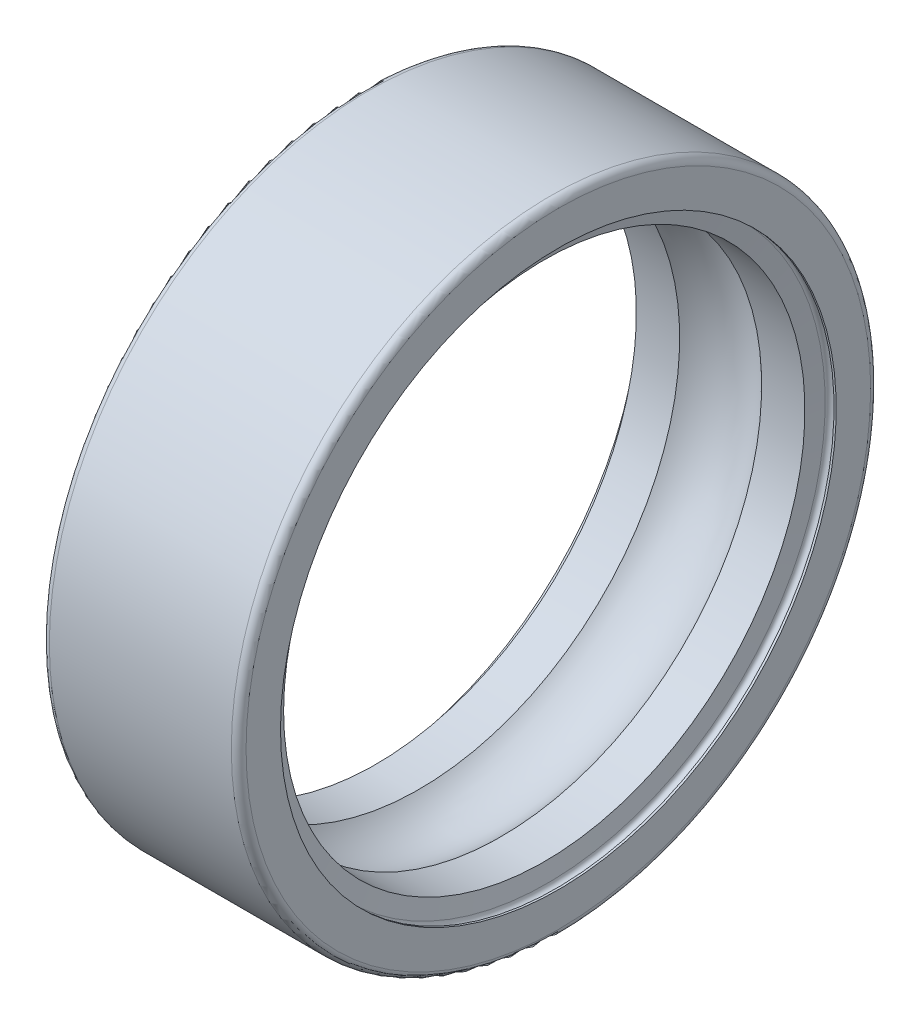
ISO-10303-21;
HEADER;
FILE_DESCRIPTION(('STEP AP214'),'2;1');
FILE_NAME('part.step','',(''),(''),'','','');
FILE_SCHEMA(('AUTOMOTIVE_DESIGN { 1 0 10303 214 1 1 1 1 }'));
ENDSEC;
DATA;
#1=APPLICATION_CONTEXT('core data for automotive mechanical design processes');
#2=APPLICATION_PROTOCOL_DEFINITION('international standard','automotive_design',2000,#1);
#3=PRODUCT_CONTEXT('',#1,'mechanical');
#4=PRODUCT('Part','Part','',(#3));
#5=PRODUCT_RELATED_PRODUCT_CATEGORY('part','',(#4));
#6=PRODUCT_DEFINITION_FORMATION('','',#4);
#7=PRODUCT_DEFINITION_CONTEXT('part definition',#1,'design');
#8=PRODUCT_DEFINITION('design','',#6,#7);
#9=PRODUCT_DEFINITION_SHAPE('','',#8);
#10=(LENGTH_UNIT() NAMED_UNIT(*) SI_UNIT(.MILLI.,.METRE.));
#11=(NAMED_UNIT(*) PLANE_ANGLE_UNIT() SI_UNIT($,.RADIAN.));
#12=(NAMED_UNIT(*) SI_UNIT($,.STERADIAN.) SOLID_ANGLE_UNIT());
#13=UNCERTAINTY_MEASURE_WITH_UNIT(LENGTH_MEASURE(1.E-05),#10,'distance_accuracy_value','');
#14=(GEOMETRIC_REPRESENTATION_CONTEXT(3) GLOBAL_UNCERTAINTY_ASSIGNED_CONTEXT((#13)) GLOBAL_UNIT_ASSIGNED_CONTEXT((#10,
#11,#12)) REPRESENTATION_CONTEXT('',''));
#15=CARTESIAN_POINT('',(0.,0.,0.));
#16=DIRECTION('',(0.,0.,1.));
#17=DIRECTION('',(1.,0.,0.));
#18=AXIS2_PLACEMENT_3D('',#15,#16,#17);
#19=CARTESIAN_POINT('',(0.,12.7,0.));
#20=DIRECTION('',(1.,0.,0.));
#21=DIRECTION('',(0.,0.,-1.));
#22=AXIS2_PLACEMENT_3D('',#19,#20,#21);
#23=PLANE('',#22);
#24=CARTESIAN_POINT('',(0.,0.,0.));
#25=DIRECTION('',(-1.,0.,0.));
#26=DIRECTION('',(0.,0.,1.));
#27=AXIS2_PLACEMENT_3D('',#24,#25,#26);
#28=CIRCLE('',#27,11.3);
#29=CARTESIAN_POINT('',(0.,0.,11.3));
#30=VERTEX_POINT('',#29);
#31=EDGE_CURVE('E78',#30,#30,#28,.T.);
#32=ORIENTED_EDGE('',*,*,#31,.F.);
#33=EDGE_LOOP('',(#32));
#34=FACE_BOUND('',#33,.T.);
#35=CARTESIAN_POINT('',(0.,0.,0.));
#36=DIRECTION('',(-1.,0.,0.));
#37=DIRECTION('',(0.,0.,1.));
#38=AXIS2_PLACEMENT_3D('',#35,#36,#37);
#39=CIRCLE('',#38,12.7);
#40=CARTESIAN_POINT('',(0.,0.,12.7));
#41=VERTEX_POINT('',#40);
#42=EDGE_CURVE('E10',#41,#41,#39,.T.);
#43=ORIENTED_EDGE('',*,*,#42,.T.);
#44=EDGE_LOOP('',(#43));
#45=FACE_BOUND('',#44,.T.);
#46=ADVANCED_FACE('F32',(#34,#45),#23,.F.);
#47=CARTESIAN_POINT('',(0.299999999999938,0.,0.));
#48=DIRECTION('',(-1.,0.,0.));
#49=DIRECTION('',(0.,0.,1.));
#50=AXIS2_PLACEMENT_3D('',#47,#48,#49);
#51=TOROIDAL_SURFACE('',#50,12.7000000000001,0.299999999999938);
#52=ORIENTED_EDGE('',*,*,#42,.F.);
#53=EDGE_LOOP('',(#52));
#54=FACE_BOUND('',#53,.T.);
#55=CARTESIAN_POINT('',(0.300000000000002,0.,0.));
#56=DIRECTION('',(-1.,0.,0.));
#57=DIRECTION('',(0.,0.,1.));
#58=AXIS2_PLACEMENT_3D('',#55,#56,#57);
#59=CIRCLE('',#58,13.);
#60=CARTESIAN_POINT('',(0.300000000000002,0.,13.));
#61=VERTEX_POINT('',#60);
#62=EDGE_CURVE('E38',#61,#61,#59,.T.);
#63=ORIENTED_EDGE('',*,*,#62,.T.);
#64=EDGE_LOOP('',(#63));
#65=FACE_BOUND('',#64,.T.);
#66=ADVANCED_FACE('F85',(#54,#65),#51,.T.);
#67=CARTESIAN_POINT('',(50.,0.,0.));
#68=DIRECTION('',(-1.,0.,0.));
#69=DIRECTION('',(0.,0.,1.));
#70=AXIS2_PLACEMENT_3D('',#67,#68,#69);
#71=CYLINDRICAL_SURFACE('',#70,13.);
#72=ORIENTED_EDGE('',*,*,#62,.F.);
#73=EDGE_LOOP('',(#72));
#74=FACE_BOUND('',#73,.T.);
#75=CARTESIAN_POINT('',(7.7,0.,0.));
#76=DIRECTION('',(-1.,0.,0.));
#77=DIRECTION('',(0.,0.,1.));
#78=AXIS2_PLACEMENT_3D('',#75,#76,#77);
#79=CIRCLE('',#78,13.);
#80=CARTESIAN_POINT('',(7.7,0.,13.));
#81=VERTEX_POINT('',#80);
#82=EDGE_CURVE('E42',#81,#81,#79,.T.);
#83=ORIENTED_EDGE('',*,*,#82,.T.);
#84=EDGE_LOOP('',(#83));
#85=FACE_BOUND('',#84,.T.);
#86=ADVANCED_FACE('F89',(#74,#85),#71,.T.);
#87=CARTESIAN_POINT('',(7.70000000000012,0.,0.));
#88=DIRECTION('',(-1.,0.,0.));
#89=DIRECTION('',(0.,0.,1.));
#90=AXIS2_PLACEMENT_3D('',#87,#88,#89);
#91=TOROIDAL_SURFACE('',#90,12.7000000000001,0.299999999999878);
#92=ORIENTED_EDGE('',*,*,#82,.F.);
#93=EDGE_LOOP('',(#92));
#94=FACE_BOUND('',#93,.T.);
#95=CARTESIAN_POINT('',(8.,0.,0.));
#96=DIRECTION('',(-1.,0.,0.));
#97=DIRECTION('',(0.,0.,1.));
#98=AXIS2_PLACEMENT_3D('',#95,#96,#97);
#99=CIRCLE('',#98,12.7);
#100=CARTESIAN_POINT('',(8.,0.,12.7));
#101=VERTEX_POINT('',#100);
#102=EDGE_CURVE('E46',#101,#101,#99,.T.);
#103=ORIENTED_EDGE('',*,*,#102,.T.);
#104=EDGE_LOOP('',(#103));
#105=FACE_BOUND('',#104,.T.);
#106=ADVANCED_FACE('F94',(#94,#105),#91,.T.);
#107=CARTESIAN_POINT('',(8.,11.3,0.));
#108=DIRECTION('',(-1.,0.,0.));
#109=DIRECTION('',(0.,0.,1.));
#110=AXIS2_PLACEMENT_3D('',#107,#108,#109);
#111=PLANE('',#110);
#112=ORIENTED_EDGE('',*,*,#102,.F.);
#113=EDGE_LOOP('',(#112));
#114=FACE_BOUND('',#113,.T.);
#115=CARTESIAN_POINT('',(8.,0.,0.));
#116=DIRECTION('',(-1.,0.,0.));
#117=DIRECTION('',(0.,0.,1.));
#118=AXIS2_PLACEMENT_3D('',#115,#116,#117);
#119=CIRCLE('',#118,11.3);
#120=CARTESIAN_POINT('',(8.,0.,11.3));
#121=VERTEX_POINT('',#120);
#122=EDGE_CURVE('E51',#121,#121,#119,.T.);
#123=ORIENTED_EDGE('',*,*,#122,.T.);
#124=EDGE_LOOP('',(#123));
#125=FACE_BOUND('',#124,.T.);
#126=ADVANCED_FACE('F100',(#114,#125),#111,.F.);
#127=CARTESIAN_POINT('',(50.,0.,0.));
#128=DIRECTION('',(-1.,0.,0.));
#129=DIRECTION('',(0.,0.,1.));
#130=AXIS2_PLACEMENT_3D('',#127,#128,#129);
#131=CYLINDRICAL_SURFACE('',#130,11.3);
#132=ORIENTED_EDGE('',*,*,#122,.F.);
#133=EDGE_LOOP('',(#132));
#134=FACE_BOUND('',#133,.T.);
#135=CARTESIAN_POINT('',(7.91,0.,0.));
#136=DIRECTION('',(-1.,0.,0.));
#137=DIRECTION('',(0.,0.,1.));
#138=AXIS2_PLACEMENT_3D('',#135,#136,#137);
#139=CIRCLE('',#138,11.3);
#140=CARTESIAN_POINT('',(7.91,0.,11.3));
#141=VERTEX_POINT('',#140);
#142=EDGE_CURVE('E54',#141,#141,#139,.T.);
#143=ORIENTED_EDGE('',*,*,#142,.T.);
#144=EDGE_LOOP('',(#143));
#145=FACE_BOUND('',#144,.T.);
#146=ADVANCED_FACE('F104',(#134,#145),#131,.F.);
#147=CARTESIAN_POINT('',(7.73,0.,0.));
#148=DIRECTION('',(-1.,0.,0.));
#149=DIRECTION('',(0.,0.,1.));
#150=AXIS2_PLACEMENT_3D('',#147,#148,#149);
#151=TOROIDAL_SURFACE('',#150,11.3,0.18);
#152=ORIENTED_EDGE('',*,*,#142,.F.);
#153=EDGE_LOOP('',(#152));
#154=FACE_BOUND('',#153,.T.);
#155=CARTESIAN_POINT('',(7.55,0.,0.));
#156=DIRECTION('',(-1.,0.,0.));
#157=DIRECTION('',(0.,0.,1.));
#158=AXIS2_PLACEMENT_3D('',#155,#156,#157);
#159=CIRCLE('',#158,11.3);
#160=CARTESIAN_POINT('',(7.55,0.,11.3));
#161=VERTEX_POINT('',#160);
#162=EDGE_CURVE('E57',#161,#161,#159,.T.);
#163=ORIENTED_EDGE('',*,*,#162,.T.);
#164=EDGE_LOOP('',(#163));
#165=FACE_BOUND('',#164,.T.);
#166=ADVANCED_FACE('F108',(#154,#165),#151,.F.);
#167=CARTESIAN_POINT('',(7.4265711135041,0.,0.));
#168=DIRECTION('',(1.,0.,0.));
#169=DIRECTION('',(0.,0.,-1.));
#170=AXIS2_PLACEMENT_3D('',#167,#168,#169);
#171=CONICAL_SURFACE('',#170,10.6,1.3962634015955);
#172=ORIENTED_EDGE('',*,*,#162,.F.);
#173=EDGE_LOOP('',(#172));
#174=FACE_BOUND('',#173,.T.);
#175=CARTESIAN_POINT('',(7.4265711135041,0.,0.));
#176=DIRECTION('',(-1.,0.,0.));
#177=DIRECTION('',(0.,0.,1.));
#178=AXIS2_PLACEMENT_3D('',#175,#176,#177);
#179=CIRCLE('',#178,10.6);
#180=CARTESIAN_POINT('',(7.4265711135041,0.,10.6));
#181=VERTEX_POINT('',#180);
#182=EDGE_CURVE('E60',#181,#181,#179,.T.);
#183=ORIENTED_EDGE('',*,*,#182,.T.);
#184=EDGE_LOOP('',(#183));
#185=FACE_BOUND('',#184,.T.);
#186=ADVANCED_FACE('F112',(#174,#185),#171,.F.);
#187=CARTESIAN_POINT('',(50.,0.,0.));
#188=DIRECTION('',(-1.,0.,0.));
#189=DIRECTION('',(0.,0.,1.));
#190=AXIS2_PLACEMENT_3D('',#187,#188,#189);
#191=CYLINDRICAL_SURFACE('',#190,10.6);
#192=ORIENTED_EDGE('',*,*,#182,.F.);
#193=EDGE_LOOP('',(#192));
#194=FACE_BOUND('',#193,.T.);
#195=CARTESIAN_POINT('',(5.667081581687,0.,0.));
#196=DIRECTION('',(-1.,0.,0.));
#197=DIRECTION('',(0.,0.,1.));
#198=AXIS2_PLACEMENT_3D('',#195,#196,#197);
#199=CIRCLE('',#198,10.6);
#200=CARTESIAN_POINT('',(5.667081581687,0.,10.6));
#201=VERTEX_POINT('',#200);
#202=EDGE_CURVE('E63',#201,#201,#199,.T.);
#203=ORIENTED_EDGE('',*,*,#202,.T.);
#204=EDGE_LOOP('',(#203));
#205=FACE_BOUND('',#204,.T.);
#206=ADVANCED_FACE('F116',(#194,#205),#191,.F.);
#207=CARTESIAN_POINT('',(4.,0.,0.));
#208=DIRECTION('',(-1.,0.,0.));
#209=DIRECTION('',(0.,0.,1.));
#210=AXIS2_PLACEMENT_3D('',#207,#208,#209);
#211=TOROIDAL_SURFACE('',#210,8.89999999999997,2.38100000000002);
#212=ORIENTED_EDGE('',*,*,#202,.F.);
#213=EDGE_LOOP('',(#212));
#214=FACE_BOUND('',#213,.T.);
#215=CARTESIAN_POINT('',(2.332918418313,0.,0.));
#216=DIRECTION('',(-1.,0.,0.));
#217=DIRECTION('',(0.,0.,1.));
#218=AXIS2_PLACEMENT_3D('',#215,#216,#217);
#219=CIRCLE('',#218,10.6);
#220=CARTESIAN_POINT('',(2.332918418313,0.,10.6));
#221=VERTEX_POINT('',#220);
#222=EDGE_CURVE('E66',#221,#221,#219,.T.);
#223=ORIENTED_EDGE('',*,*,#222,.T.);
#224=EDGE_LOOP('',(#223));
#225=FACE_BOUND('',#224,.T.);
#226=ADVANCED_FACE('F120',(#214,#225),#211,.F.);
#227=CARTESIAN_POINT('',(50.,0.,0.));
#228=DIRECTION('',(-1.,0.,0.));
#229=DIRECTION('',(0.,0.,1.));
#230=AXIS2_PLACEMENT_3D('',#227,#228,#229);
#231=CYLINDRICAL_SURFACE('',#230,10.6);
#232=ORIENTED_EDGE('',*,*,#222,.F.);
#233=EDGE_LOOP('',(#232));
#234=FACE_BOUND('',#233,.T.);
#235=CARTESIAN_POINT('',(0.573428886495919,0.,0.));
#236=DIRECTION('',(-1.,0.,0.));
#237=DIRECTION('',(0.,0.,1.));
#238=AXIS2_PLACEMENT_3D('',#235,#236,#237);
#239=CIRCLE('',#238,10.6);
#240=CARTESIAN_POINT('',(0.573428886495919,0.,10.6));
#241=VERTEX_POINT('',#240);
#242=EDGE_CURVE('E69',#241,#241,#239,.T.);
#243=ORIENTED_EDGE('',*,*,#242,.T.);
#244=EDGE_LOOP('',(#243));
#245=FACE_BOUND('',#244,.T.);
#246=ADVANCED_FACE('F124',(#234,#245),#231,.F.);
#247=CARTESIAN_POINT('',(0.449999999999999,0.,0.));
#248=DIRECTION('',(-1.,0.,0.));
#249=DIRECTION('',(0.,0.,1.));
#250=AXIS2_PLACEMENT_3D('',#247,#248,#249);
#251=CONICAL_SURFACE('',#250,11.3,1.39626340159547);
#252=ORIENTED_EDGE('',*,*,#242,.F.);
#253=EDGE_LOOP('',(#252));
#254=FACE_BOUND('',#253,.T.);
#255=CARTESIAN_POINT('',(0.449999999999999,0.,0.));
#256=DIRECTION('',(-1.,0.,0.));
#257=DIRECTION('',(0.,0.,1.));
#258=AXIS2_PLACEMENT_3D('',#255,#256,#257);
#259=CIRCLE('',#258,11.3);
#260=CARTESIAN_POINT('',(0.449999999999999,0.,11.3));
#261=VERTEX_POINT('',#260);
#262=EDGE_CURVE('E72',#261,#261,#259,.T.);
#263=ORIENTED_EDGE('',*,*,#262,.T.);
#264=EDGE_LOOP('',(#263));
#265=FACE_BOUND('',#264,.T.);
#266=ADVANCED_FACE('F128',(#254,#265),#251,.F.);
#267=CARTESIAN_POINT('',(0.27,0.,0.));
#268=DIRECTION('',(-1.,0.,0.));
#269=DIRECTION('',(0.,0.,1.));
#270=AXIS2_PLACEMENT_3D('',#267,#268,#269);
#271=TOROIDAL_SURFACE('',#270,11.3,0.18);
#272=ORIENTED_EDGE('',*,*,#262,.F.);
#273=EDGE_LOOP('',(#272));
#274=FACE_BOUND('',#273,.T.);
#275=CARTESIAN_POINT('',(0.0899999999999998,0.,0.));
#276=DIRECTION('',(-1.,0.,0.));
#277=DIRECTION('',(0.,0.,1.));
#278=AXIS2_PLACEMENT_3D('',#275,#276,#277);
#279=CIRCLE('',#278,11.3);
#280=CARTESIAN_POINT('',(0.0899999999999998,0.,11.3));
#281=VERTEX_POINT('',#280);
#282=EDGE_CURVE('E75',#281,#281,#279,.T.);
#283=ORIENTED_EDGE('',*,*,#282,.T.);
#284=EDGE_LOOP('',(#283));
#285=FACE_BOUND('',#284,.T.);
#286=ADVANCED_FACE('F132',(#274,#285),#271,.F.);
#287=CARTESIAN_POINT('',(50.,0.,0.));
#288=DIRECTION('',(-1.,0.,0.));
#289=DIRECTION('',(0.,0.,1.));
#290=AXIS2_PLACEMENT_3D('',#287,#288,#289);
#291=CYLINDRICAL_SURFACE('',#290,11.3);
#292=ORIENTED_EDGE('',*,*,#282,.F.);
#293=EDGE_LOOP('',(#292));
#294=FACE_BOUND('',#293,.T.);
#295=ORIENTED_EDGE('',*,*,#31,.T.);
#296=EDGE_LOOP('',(#295));
#297=FACE_BOUND('',#296,.T.);
#298=ADVANCED_FACE('F82',(#294,#297),#291,.F.);
#299=CLOSED_SHELL('',(#46,#66,#86,#106,#126,#146,#166,#186,#206,#226,#246,#266,#286,#298));
#300=MANIFOLD_SOLID_BREP('B2',#299);
#301=ADVANCED_BREP_SHAPE_REPRESENTATION('',(#18,#300),#14);
#302=SHAPE_DEFINITION_REPRESENTATION(#9,#301);
ENDSEC;
END-ISO-10303-21;
